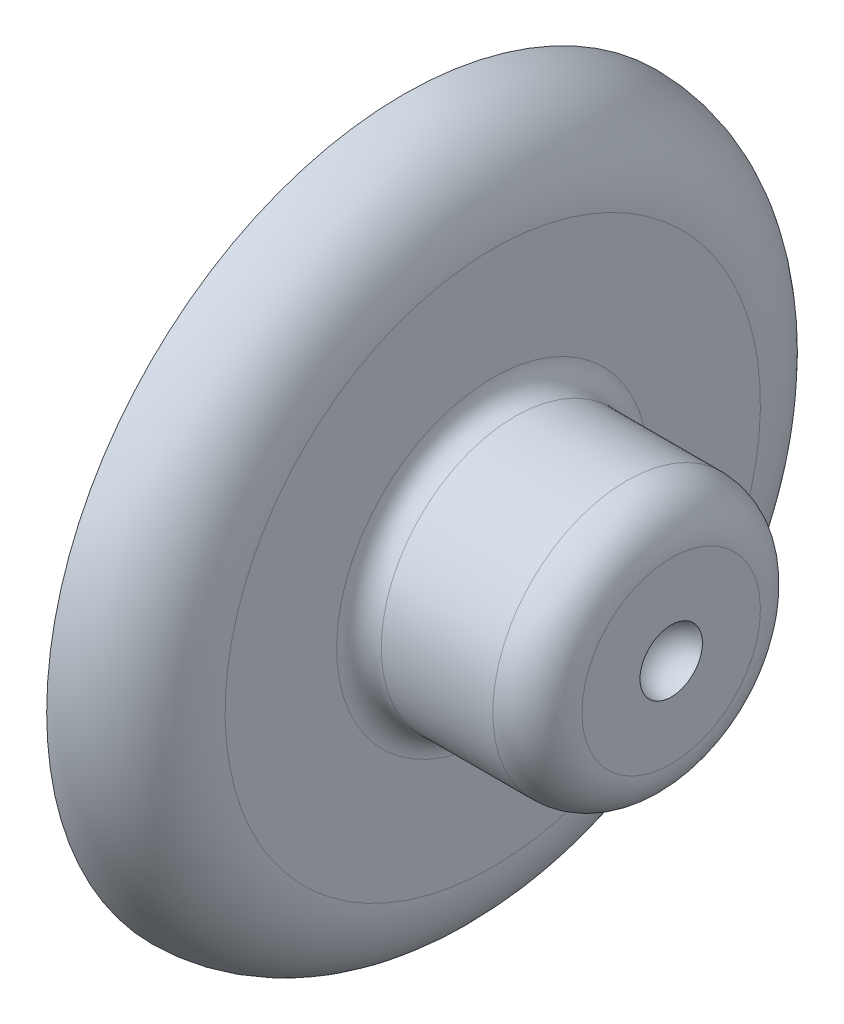
ISO-10303-21;
HEADER;
FILE_DESCRIPTION(('STEP AP214'),'2;1');
FILE_NAME('part.step','',(''),(''),'','','');
FILE_SCHEMA(('AUTOMOTIVE_DESIGN { 1 0 10303 214 1 1 1 1 }'));
ENDSEC;
DATA;
#1=APPLICATION_CONTEXT('core data for automotive mechanical design processes');
#2=APPLICATION_PROTOCOL_DEFINITION('international standard','automotive_design',2000,#1);
#3=PRODUCT_CONTEXT('',#1,'mechanical');
#4=PRODUCT('Part','Part','',(#3));
#5=PRODUCT_RELATED_PRODUCT_CATEGORY('part','',(#4));
#6=PRODUCT_DEFINITION_FORMATION('','',#4);
#7=PRODUCT_DEFINITION_CONTEXT('part definition',#1,'design');
#8=PRODUCT_DEFINITION('design','',#6,#7);
#9=PRODUCT_DEFINITION_SHAPE('','',#8);
#10=(LENGTH_UNIT() NAMED_UNIT(*) SI_UNIT(.MILLI.,.METRE.));
#11=(NAMED_UNIT(*) PLANE_ANGLE_UNIT() SI_UNIT($,.RADIAN.));
#12=(NAMED_UNIT(*) SI_UNIT($,.STERADIAN.) SOLID_ANGLE_UNIT());
#13=UNCERTAINTY_MEASURE_WITH_UNIT(LENGTH_MEASURE(1.E-05),#10,'distance_accuracy_value','');
#14=(GEOMETRIC_REPRESENTATION_CONTEXT(3) GLOBAL_UNCERTAINTY_ASSIGNED_CONTEXT((#13)) GLOBAL_UNIT_ASSIGNED_CONTEXT((#10,
#11,#12)) REPRESENTATION_CONTEXT('',''));
#15=CARTESIAN_POINT('',(0.,0.,0.));
#16=DIRECTION('',(0.,0.,1.));
#17=DIRECTION('',(1.,0.,0.));
#18=AXIS2_PLACEMENT_3D('',#15,#16,#17);
#19=CARTESIAN_POINT('',(0.,0.,0.));
#20=DIRECTION('',(1.,0.,0.));
#21=DIRECTION('',(0.,1.,0.));
#22=AXIS2_PLACEMENT_3D('',#19,#20,#21);
#23=PLANE('',#22);
#24=CARTESIAN_POINT('',(0.,0.,0.));
#25=DIRECTION('',(-1.,0.,0.));
#26=DIRECTION('',(0.,-1.,0.));
#27=AXIS2_PLACEMENT_3D('',#24,#25,#26);
#28=CIRCLE('',#27,8.);
#29=CARTESIAN_POINT('',(0.,-8.,0.));
#30=VERTEX_POINT('',#29);
#31=EDGE_CURVE('E10',#30,#30,#28,.T.);
#32=ORIENTED_EDGE('',*,*,#31,.T.);
#33=EDGE_LOOP('',(#32));
#34=FACE_BOUND('',#33,.T.);
#35=ADVANCED_FACE('F31',(#34),#23,.F.);
#36=CARTESIAN_POINT('',(0.,0.,0.));
#37=DIRECTION('',(-1.,0.,0.));
#38=DIRECTION('',(0.,-1.,0.));
#39=AXIS2_PLACEMENT_3D('',#36,#37,#38);
#40=TOROIDAL_SURFACE('',#39,6.,2.);
#41=ORIENTED_EDGE('',*,*,#31,.F.);
#42=EDGE_LOOP('',(#41));
#43=FACE_BOUND('',#42,.T.);
#44=CARTESIAN_POINT('',(2.,0.,0.));
#45=DIRECTION('',(-1.,0.,0.));
#46=DIRECTION('',(0.,-1.,0.));
#47=AXIS2_PLACEMENT_3D('',#44,#45,#46);
#48=CIRCLE('',#47,6.);
#49=CARTESIAN_POINT('',(2.,-6.,0.));
#50=VERTEX_POINT('',#49);
#51=EDGE_CURVE('E37',#50,#50,#48,.T.);
#52=ORIENTED_EDGE('',*,*,#51,.T.);
#53=EDGE_LOOP('',(#52));
#54=FACE_BOUND('',#53,.T.);
#55=ADVANCED_FACE('F72',(#43,#54),#40,.T.);
#56=CARTESIAN_POINT('',(2.,6.,0.));
#57=DIRECTION('',(-1.,0.,0.));
#58=DIRECTION('',(0.,-1.,0.));
#59=AXIS2_PLACEMENT_3D('',#56,#57,#58);
#60=PLANE('',#59);
#61=ORIENTED_EDGE('',*,*,#51,.F.);
#62=EDGE_LOOP('',(#61));
#63=FACE_BOUND('',#62,.T.);
#64=CARTESIAN_POINT('',(2.,0.,0.));
#65=DIRECTION('',(-1.,0.,0.));
#66=DIRECTION('',(0.,-1.,0.));
#67=AXIS2_PLACEMENT_3D('',#64,#65,#66);
#68=CIRCLE('',#67,3.5);
#69=CARTESIAN_POINT('',(2.,-3.5,0.));
#70=VERTEX_POINT('',#69);
#71=EDGE_CURVE('E41',#70,#70,#68,.T.);
#72=ORIENTED_EDGE('',*,*,#71,.T.);
#73=EDGE_LOOP('',(#72));
#74=FACE_BOUND('',#73,.T.);
#75=ADVANCED_FACE('F76',(#63,#74),#60,.F.);
#76=CARTESIAN_POINT('',(2.5,0.,0.));
#77=DIRECTION('',(-1.,0.,0.));
#78=DIRECTION('',(0.,-1.,0.));
#79=AXIS2_PLACEMENT_3D('',#76,#77,#78);
#80=TOROIDAL_SURFACE('',#79,3.5,0.500000000000001);
#81=ORIENTED_EDGE('',*,*,#71,.F.);
#82=EDGE_LOOP('',(#81));
#83=FACE_BOUND('',#82,.T.);
#84=CARTESIAN_POINT('',(2.5,0.,0.));
#85=DIRECTION('',(-1.,0.,0.));
#86=DIRECTION('',(0.,-1.,0.));
#87=AXIS2_PLACEMENT_3D('',#84,#85,#86);
#88=CIRCLE('',#87,3.);
#89=CARTESIAN_POINT('',(2.5,-3.,0.));
#90=VERTEX_POINT('',#89);
#91=EDGE_CURVE('E45',#90,#90,#88,.T.);
#92=ORIENTED_EDGE('',*,*,#91,.T.);
#93=EDGE_LOOP('',(#92));
#94=FACE_BOUND('',#93,.T.);
#95=ADVANCED_FACE('F81',(#83,#94),#80,.F.);
#96=CARTESIAN_POINT('',(6.,0.,0.));
#97=DIRECTION('',(-1.,0.,0.));
#98=DIRECTION('',(0.,-1.,0.));
#99=AXIS2_PLACEMENT_3D('',#96,#97,#98);
#100=CYLINDRICAL_SURFACE('',#99,3.);
#101=ORIENTED_EDGE('',*,*,#91,.F.);
#102=EDGE_LOOP('',(#101));
#103=FACE_BOUND('',#102,.T.);
#104=CARTESIAN_POINT('',(5.,0.,0.));
#105=DIRECTION('',(-1.,0.,0.));
#106=DIRECTION('',(0.,-1.,0.));
#107=AXIS2_PLACEMENT_3D('',#104,#105,#106);
#108=CIRCLE('',#107,3.);
#109=CARTESIAN_POINT('',(5.,-3.,0.));
#110=VERTEX_POINT('',#109);
#111=EDGE_CURVE('E50',#110,#110,#108,.T.);
#112=ORIENTED_EDGE('',*,*,#111,.T.);
#113=EDGE_LOOP('',(#112));
#114=FACE_BOUND('',#113,.T.);
#115=ADVANCED_FACE('F87',(#103,#114),#100,.T.);
#116=CARTESIAN_POINT('',(5.,0.,0.));
#117=DIRECTION('',(-1.,0.,0.));
#118=DIRECTION('',(0.,-1.,0.));
#119=AXIS2_PLACEMENT_3D('',#116,#117,#118);
#120=TOROIDAL_SURFACE('',#119,2.,1.);
#121=ORIENTED_EDGE('',*,*,#111,.F.);
#122=EDGE_LOOP('',(#121));
#123=FACE_BOUND('',#122,.T.);
#124=CARTESIAN_POINT('',(6.,0.,0.));
#125=DIRECTION('',(-1.,0.,0.));
#126=DIRECTION('',(0.,-1.,0.));
#127=AXIS2_PLACEMENT_3D('',#124,#125,#126);
#128=CIRCLE('',#127,2.);
#129=CARTESIAN_POINT('',(6.,-2.,0.));
#130=VERTEX_POINT('',#129);
#131=EDGE_CURVE('E53',#130,#130,#128,.T.);
#132=ORIENTED_EDGE('',*,*,#131,.T.);
#133=EDGE_LOOP('',(#132));
#134=FACE_BOUND('',#133,.T.);
#135=ADVANCED_FACE('F68',(#123,#134),#120,.T.);
#136=CARTESIAN_POINT('',(6.,2.,0.));
#137=DIRECTION('',(-1.,0.,0.));
#138=DIRECTION('',(0.,-1.,0.));
#139=AXIS2_PLACEMENT_3D('',#136,#137,#138);
#140=PLANE('',#139);
#141=ORIENTED_EDGE('',*,*,#131,.F.);
#142=EDGE_LOOP('',(#141));
#143=FACE_BOUND('',#142,.T.);
#144=CARTESIAN_POINT('',(6.,0.,0.));
#145=DIRECTION('',(-1.,0.,0.));
#146=DIRECTION('',(0.,-1.,0.));
#147=AXIS2_PLACEMENT_3D('',#144,#145,#146);
#148=CIRCLE('',#147,0.7);
#149=CARTESIAN_POINT('',(6.,-0.7,0.));
#150=VERTEX_POINT('',#149);
#151=EDGE_CURVE('E56',#150,#150,#148,.T.);
#152=ORIENTED_EDGE('',*,*,#151,.T.);
#153=EDGE_LOOP('',(#152));
#154=FACE_BOUND('',#153,.T.);
#155=ADVANCED_FACE('F60',(#143,#154),#140,.F.);
#156=CARTESIAN_POINT('',(6.,0.,0.));
#157=DIRECTION('',(-1.,0.,0.));
#158=DIRECTION('',(0.,1.,0.));
#159=AXIS2_PLACEMENT_3D('',#156,#157,#158);
#160=SPHERICAL_SURFACE('',#159,0.7);
#161=ORIENTED_EDGE('',*,*,#151,.F.);
#162=EDGE_LOOP('',(#161));
#163=FACE_BOUND('',#162,.T.);
#164=ADVANCED_FACE('F62',(#163),#160,.F.);
#165=CLOSED_SHELL('',(#35,#55,#75,#95,#115,#135,#155,#164));
#166=MANIFOLD_SOLID_BREP('B2',#165);
#167=ADVANCED_BREP_SHAPE_REPRESENTATION('',(#18,#166),#14);
#168=SHAPE_DEFINITION_REPRESENTATION(#9,#167);
ENDSEC;
END-ISO-10303-21;
